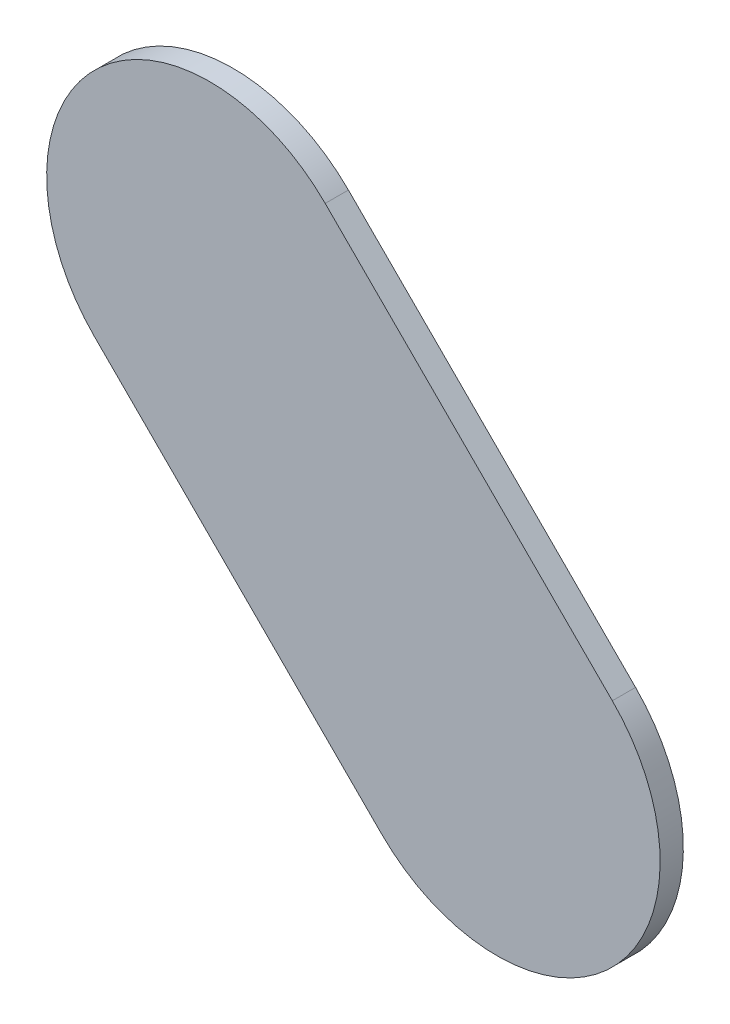
ISO-10303-21;
HEADER;
FILE_DESCRIPTION(('STEP AP214'),'2;1');
FILE_NAME('part.step','',(''),(''),'','','');
FILE_SCHEMA(('AUTOMOTIVE_DESIGN { 1 0 10303 214 1 1 1 1 }'));
ENDSEC;
DATA;
#1=APPLICATION_CONTEXT('core data for automotive mechanical design processes');
#2=APPLICATION_PROTOCOL_DEFINITION('international standard','automotive_design',2000,#1);
#3=PRODUCT_CONTEXT('',#1,'mechanical');
#4=PRODUCT('Part','Part','',(#3));
#5=PRODUCT_RELATED_PRODUCT_CATEGORY('part','',(#4));
#6=PRODUCT_DEFINITION_FORMATION('','',#4);
#7=PRODUCT_DEFINITION_CONTEXT('part definition',#1,'design');
#8=PRODUCT_DEFINITION('design','',#6,#7);
#9=PRODUCT_DEFINITION_SHAPE('','',#8);
#10=(LENGTH_UNIT() NAMED_UNIT(*) SI_UNIT(.MILLI.,.METRE.));
#11=(NAMED_UNIT(*) PLANE_ANGLE_UNIT() SI_UNIT($,.RADIAN.));
#12=(NAMED_UNIT(*) SI_UNIT($,.STERADIAN.) SOLID_ANGLE_UNIT());
#13=UNCERTAINTY_MEASURE_WITH_UNIT(LENGTH_MEASURE(1.E-05),#10,'distance_accuracy_value','');
#14=(GEOMETRIC_REPRESENTATION_CONTEXT(3) GLOBAL_UNCERTAINTY_ASSIGNED_CONTEXT((#13)) GLOBAL_UNIT_ASSIGNED_CONTEXT((#10,
#11,#12)) REPRESENTATION_CONTEXT('',''));
#15=CARTESIAN_POINT('',(0.,0.,0.));
#16=DIRECTION('',(0.,0.,1.));
#17=DIRECTION('',(1.,0.,0.));
#18=AXIS2_PLACEMENT_3D('',#15,#16,#17);
#19=CARTESIAN_POINT('',(114.22324882,114.91880242,0.));
#20=DIRECTION('',(0.707106781186559,0.707106781186536,0.));
#21=DIRECTION('',(0.707106781186536,-0.707106781186559,0.));
#22=AXIS2_PLACEMENT_3D('',#19,#20,#21);
#23=PLANE('',#22);
#24=DIRECTION('',(0.707106781186536,-0.707106781186559,0.));
#25=VECTOR('',#24,1.);
#26=CARTESIAN_POINT('',(114.22324882,114.91880242,0.03556));
#27=LINE('',#26,#25);
#28=CARTESIAN_POINT('',(114.22324882,114.91880242,0.03556));
#29=VERTEX_POINT('',#28);
#30=CARTESIAN_POINT('',(114.66322762,114.47882362,0.03556));
#31=VERTEX_POINT('',#30);
#32=EDGE_CURVE('E11',#29,#31,#27,.T.);
#33=ORIENTED_EDGE('',*,*,#32,.F.);
#34=DIRECTION('',(0.,0.,1.));
#35=VECTOR('',#34,1.);
#36=CARTESIAN_POINT('',(114.22324882,114.91880242,0.));
#37=LINE('',#36,#35);
#38=CARTESIAN_POINT('',(114.22324882,114.91880242,0.));
#39=VERTEX_POINT('',#38);
#40=EDGE_CURVE('E24',#39,#29,#37,.T.);
#41=ORIENTED_EDGE('',*,*,#40,.F.);
#42=DIRECTION('',(0.707106781186536,-0.707106781186559,0.));
#43=VECTOR('',#42,1.);
#44=CARTESIAN_POINT('',(114.22324882,114.91880242,0.));
#45=LINE('',#44,#43);
#46=CARTESIAN_POINT('',(114.66322762,114.47882362,0.));
#47=VERTEX_POINT('',#46);
#48=EDGE_CURVE('E75',#39,#47,#45,.T.);
#49=ORIENTED_EDGE('',*,*,#48,.T.);
#50=DIRECTION('',(0.,0.,1.));
#51=VECTOR('',#50,1.);
#52=CARTESIAN_POINT('',(114.66322762,114.47882362,0.));
#53=LINE('',#52,#51);
#54=EDGE_CURVE('E37',#47,#31,#53,.T.);
#55=ORIENTED_EDGE('',*,*,#54,.T.);
#56=EDGE_LOOP('',(#33,#41,#49,#55));
#57=FACE_BOUND('',#56,.T.);
#58=ADVANCED_FACE('F17',(#57),#23,.F.);
#59=CARTESIAN_POINT('',(114.840004,114.6556,0.));
#60=DIRECTION('',(0.,0.,-1.));
#61=DIRECTION('',(-0.707106781186519,-0.707106781186576,0.));
#62=AXIS2_PLACEMENT_3D('',#59,#60,#61);
#63=CYLINDRICAL_SURFACE('',#62,0.249999554103216);
#64=CARTESIAN_POINT('',(114.840004,114.6556,0.03556));
#65=DIRECTION('',(0.,0.,1.));
#66=DIRECTION('',(-0.707106781186519,-0.707106781186576,0.));
#67=AXIS2_PLACEMENT_3D('',#64,#65,#66);
#68=CIRCLE('',#67,0.249999554103216);
#69=CARTESIAN_POINT('',(115.01678038,114.83237638,0.03556));
#70=VERTEX_POINT('',#69);
#71=EDGE_CURVE('E83',#31,#70,#68,.T.);
#72=ORIENTED_EDGE('',*,*,#71,.F.);
#73=ORIENTED_EDGE('',*,*,#54,.F.);
#74=CARTESIAN_POINT('',(114.840004,114.6556,0.));
#75=DIRECTION('',(0.,0.,1.));
#76=DIRECTION('',(-0.707106781186519,-0.707106781186576,0.));
#77=AXIS2_PLACEMENT_3D('',#74,#75,#76);
#78=CIRCLE('',#77,0.249999554103216);
#79=CARTESIAN_POINT('',(115.01678038,114.83237638,0.));
#80=VERTEX_POINT('',#79);
#81=EDGE_CURVE('E81',#47,#80,#78,.T.);
#82=ORIENTED_EDGE('',*,*,#81,.T.);
#83=DIRECTION('',(0.,0.,1.));
#84=VECTOR('',#83,1.);
#85=CARTESIAN_POINT('',(115.01678038,114.83237638,0.));
#86=LINE('',#85,#84);
#87=EDGE_CURVE('E67',#80,#70,#86,.T.);
#88=ORIENTED_EDGE('',*,*,#87,.T.);
#89=EDGE_LOOP('',(#72,#73,#82,#88));
#90=FACE_BOUND('',#89,.T.);
#91=ADVANCED_FACE('F89',(#90),#63,.T.);
#92=CARTESIAN_POINT('',(115.01678038,114.83237638,0.));
#93=DIRECTION('',(-0.70710678118657,-0.707106781186525,0.));
#94=DIRECTION('',(-0.707106781186525,0.70710678118657,0.));
#95=AXIS2_PLACEMENT_3D('',#92,#93,#94);
#96=PLANE('',#95);
#97=DIRECTION('',(-0.707106781186525,0.70710678118657,0.));
#98=VECTOR('',#97,1.);
#99=CARTESIAN_POINT('',(115.01678038,114.83237638,0.03556));
#100=LINE('',#99,#98);
#101=CARTESIAN_POINT('',(114.57680158,115.27235518,0.03556));
#102=VERTEX_POINT('',#101);
#103=EDGE_CURVE('E71',#70,#102,#100,.T.);
#104=ORIENTED_EDGE('',*,*,#103,.F.);
#105=ORIENTED_EDGE('',*,*,#87,.F.);
#106=DIRECTION('',(-0.707106781186525,0.70710678118657,0.));
#107=VECTOR('',#106,1.);
#108=CARTESIAN_POINT('',(115.01678038,114.83237638,0.));
#109=LINE('',#108,#107);
#110=CARTESIAN_POINT('',(114.57680158,115.27235518,0.));
#111=VERTEX_POINT('',#110);
#112=EDGE_CURVE('E63',#80,#111,#109,.T.);
#113=ORIENTED_EDGE('',*,*,#112,.T.);
#114=DIRECTION('',(0.,0.,1.));
#115=VECTOR('',#114,1.);
#116=CARTESIAN_POINT('',(114.57680158,115.27235518,0.));
#117=LINE('',#116,#115);
#118=EDGE_CURVE('E53',#111,#102,#117,.T.);
#119=ORIENTED_EDGE('',*,*,#118,.T.);
#120=EDGE_LOOP('',(#104,#105,#113,#119));
#121=FACE_BOUND('',#120,.T.);
#122=ADVANCED_FACE('F66',(#121),#96,.F.);
#123=CARTESIAN_POINT('',(114.4000252,115.0955788,0.));
#124=DIRECTION('',(0.,0.,-1.));
#125=DIRECTION('',(0.707106781186519,0.707106781186576,0.));
#126=AXIS2_PLACEMENT_3D('',#123,#124,#125);
#127=CYLINDRICAL_SURFACE('',#126,0.24999955410322);
#128=CARTESIAN_POINT('',(114.4000252,115.0955788,0.03556));
#129=DIRECTION('',(0.,0.,1.));
#130=DIRECTION('',(0.707106781186519,0.707106781186576,0.));
#131=AXIS2_PLACEMENT_3D('',#128,#129,#130);
#132=CIRCLE('',#131,0.24999955410322);
#133=EDGE_CURVE('E59',#102,#29,#132,.T.);
#134=ORIENTED_EDGE('',*,*,#133,.F.);
#135=ORIENTED_EDGE('',*,*,#118,.F.);
#136=CARTESIAN_POINT('',(114.4000252,115.0955788,0.));
#137=DIRECTION('',(0.,0.,1.));
#138=DIRECTION('',(0.707106781186519,0.707106781186576,0.));
#139=AXIS2_PLACEMENT_3D('',#136,#137,#138);
#140=CIRCLE('',#139,0.24999955410322);
#141=EDGE_CURVE('E57',#111,#39,#140,.T.);
#142=ORIENTED_EDGE('',*,*,#141,.T.);
#143=ORIENTED_EDGE('',*,*,#40,.T.);
#144=EDGE_LOOP('',(#134,#135,#142,#143));
#145=FACE_BOUND('',#144,.T.);
#146=ADVANCED_FACE('F55',(#145),#127,.T.);
#147=CARTESIAN_POINT('',(114.22324882,114.91880242,0.));
#148=DIRECTION('',(0.,0.,-1.));
#149=DIRECTION('',(-1.,0.,0.));
#150=AXIS2_PLACEMENT_3D('',#147,#148,#149);
#151=PLANE('',#150);
#152=ORIENTED_EDGE('',*,*,#141,.F.);
#153=ORIENTED_EDGE('',*,*,#112,.F.);
#154=ORIENTED_EDGE('',*,*,#81,.F.);
#155=ORIENTED_EDGE('',*,*,#48,.F.);
#156=EDGE_LOOP('',(#152,#153,#154,#155));
#157=FACE_BOUND('',#156,.T.);
#158=ADVANCED_FACE('F74',(#157),#151,.T.);
#159=CARTESIAN_POINT('',(114.22324882,114.91880242,0.03556));
#160=DIRECTION('',(0.,0.,-1.));
#161=DIRECTION('',(-1.,0.,0.));
#162=AXIS2_PLACEMENT_3D('',#159,#160,#161);
#163=PLANE('',#162);
#164=ORIENTED_EDGE('',*,*,#32,.T.);
#165=ORIENTED_EDGE('',*,*,#71,.T.);
#166=ORIENTED_EDGE('',*,*,#103,.T.);
#167=ORIENTED_EDGE('',*,*,#133,.T.);
#168=EDGE_LOOP('',(#164,#165,#166,#167));
#169=FACE_BOUND('',#168,.T.);
#170=ADVANCED_FACE('F91',(#169),#163,.F.);
#171=CLOSED_SHELL('',(#58,#91,#122,#146,#158,#170));
#172=MANIFOLD_SOLID_BREP('B1',#171);
#173=ADVANCED_BREP_SHAPE_REPRESENTATION('',(#18,#172),#14);
#174=SHAPE_DEFINITION_REPRESENTATION(#9,#173);
ENDSEC;
END-ISO-10303-21;
